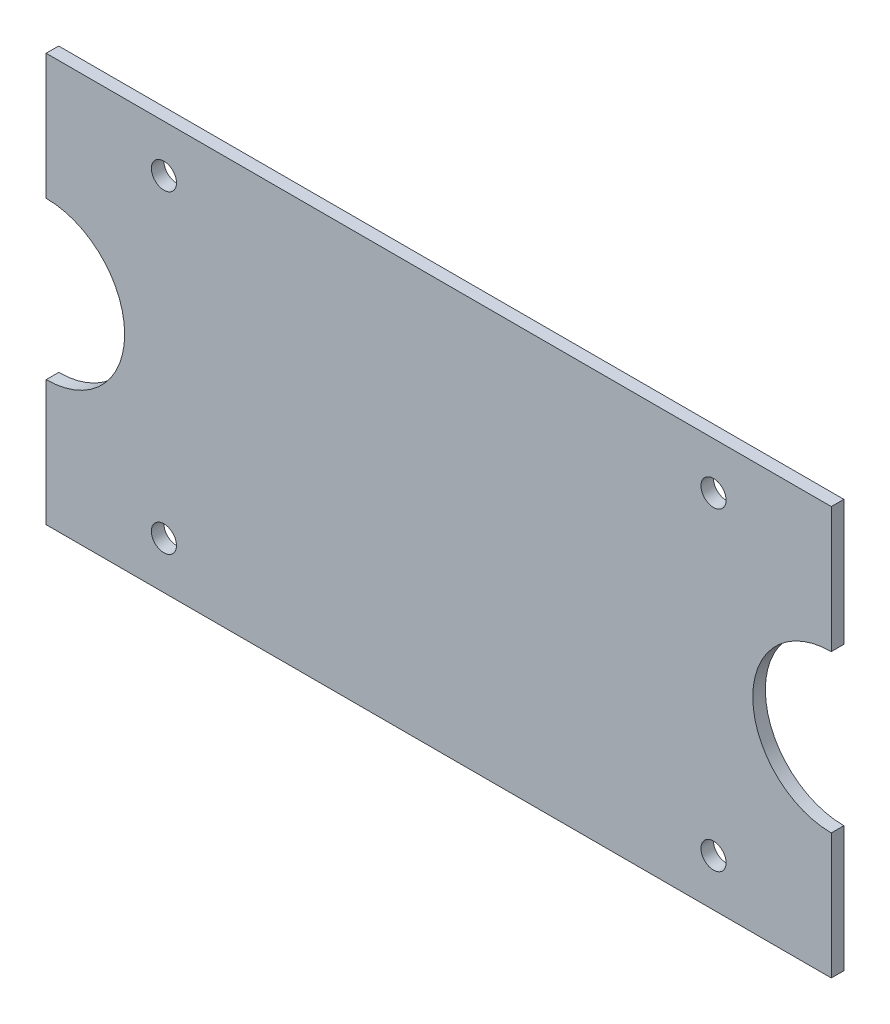
ISO-10303-21;
HEADER;
FILE_DESCRIPTION(('STEP AP214'),'2;1');
FILE_NAME('part.step','',(''),(''),'','','');
FILE_SCHEMA(('AUTOMOTIVE_DESIGN { 1 0 10303 214 1 1 1 1 }'));
ENDSEC;
DATA;
#1=APPLICATION_CONTEXT('core data for automotive mechanical design processes');
#2=APPLICATION_PROTOCOL_DEFINITION('international standard','automotive_design',2000,#1);
#3=PRODUCT_CONTEXT('',#1,'mechanical');
#4=PRODUCT('Part','Part','',(#3));
#5=PRODUCT_RELATED_PRODUCT_CATEGORY('part','',(#4));
#6=PRODUCT_DEFINITION_FORMATION('','',#4);
#7=PRODUCT_DEFINITION_CONTEXT('part definition',#1,'design');
#8=PRODUCT_DEFINITION('design','',#6,#7);
#9=PRODUCT_DEFINITION_SHAPE('','',#8);
#10=(LENGTH_UNIT() NAMED_UNIT(*) SI_UNIT(.MILLI.,.METRE.));
#11=(NAMED_UNIT(*) PLANE_ANGLE_UNIT() SI_UNIT($,.RADIAN.));
#12=(NAMED_UNIT(*) SI_UNIT($,.STERADIAN.) SOLID_ANGLE_UNIT());
#13=UNCERTAINTY_MEASURE_WITH_UNIT(LENGTH_MEASURE(1.E-05),#10,'distance_accuracy_value','');
#14=(GEOMETRIC_REPRESENTATION_CONTEXT(3) GLOBAL_UNCERTAINTY_ASSIGNED_CONTEXT((#13)) GLOBAL_UNIT_ASSIGNED_CONTEXT((#10,
#11,#12)) REPRESENTATION_CONTEXT('',''));
#15=CARTESIAN_POINT('',(0.,0.,0.));
#16=DIRECTION('',(0.,0.,1.));
#17=DIRECTION('',(1.,0.,0.));
#18=AXIS2_PLACEMENT_3D('',#15,#16,#17);
#19=CARTESIAN_POINT('',(0.,0.,1.6));
#20=DIRECTION('',(1.,0.,0.));
#21=DIRECTION('',(0.,0.,-1.));
#22=AXIS2_PLACEMENT_3D('',#19,#20,#21);
#23=PLANE('',#22);
#24=DIRECTION('',(0.,-1.,0.));
#25=VECTOR('',#24,1.);
#26=CARTESIAN_POINT('',(0.,0.,1.6));
#27=LINE('',#26,#25);
#28=CARTESIAN_POINT('',(0.,16.,1.6));
#29=VERTEX_POINT('',#28);
#30=CARTESIAN_POINT('',(0.,0.,1.6));
#31=VERTEX_POINT('',#30);
#32=EDGE_CURVE('E133',#29,#31,#27,.T.);
#33=ORIENTED_EDGE('',*,*,#32,.F.);
#34=DIRECTION('',(0.,0.,-1.));
#35=VECTOR('',#34,1.);
#36=CARTESIAN_POINT('',(0.,16.,1.6));
#37=LINE('',#36,#35);
#38=CARTESIAN_POINT('',(0.,16.,0.));
#39=VERTEX_POINT('',#38);
#40=EDGE_CURVE('E11',#29,#39,#37,.T.);
#41=ORIENTED_EDGE('',*,*,#40,.T.);
#42=DIRECTION('',(0.,-1.,0.));
#43=VECTOR('',#42,1.);
#44=CARTESIAN_POINT('',(0.,0.,0.));
#45=LINE('',#44,#43);
#46=CARTESIAN_POINT('',(0.,0.,0.));
#47=VERTEX_POINT('',#46);
#48=EDGE_CURVE('E168',#39,#47,#45,.T.);
#49=ORIENTED_EDGE('',*,*,#48,.T.);
#50=DIRECTION('',(0.,0.,-1.));
#51=VECTOR('',#50,1.);
#52=CARTESIAN_POINT('',(0.,0.,1.6));
#53=LINE('',#52,#51);
#54=EDGE_CURVE('E143',#31,#47,#53,.T.);
#55=ORIENTED_EDGE('',*,*,#54,.F.);
#56=EDGE_LOOP('',(#33,#41,#49,#55));
#57=FACE_BOUND('',#56,.T.);
#58=ADVANCED_FACE('F39',(#57),#23,.F.);
#59=CARTESIAN_POINT('',(100.,0.,1.6));
#60=DIRECTION('',(-1.,0.,0.));
#61=DIRECTION('',(0.,0.,1.));
#62=AXIS2_PLACEMENT_3D('',#59,#60,#61);
#63=PLANE('',#62);
#64=DIRECTION('',(0.,1.,0.));
#65=VECTOR('',#64,1.);
#66=CARTESIAN_POINT('',(100.,0.,1.6));
#67=LINE('',#66,#65);
#68=CARTESIAN_POINT('',(100.,36.,1.6));
#69=VERTEX_POINT('',#68);
#70=CARTESIAN_POINT('',(100.,52.,1.6));
#71=VERTEX_POINT('',#70);
#72=EDGE_CURVE('E118',#69,#71,#67,.T.);
#73=ORIENTED_EDGE('',*,*,#72,.F.);
#74=DIRECTION('',(0.,0.,-1.));
#75=VECTOR('',#74,1.);
#76=CARTESIAN_POINT('',(100.,36.,1.6));
#77=LINE('',#76,#75);
#78=CARTESIAN_POINT('',(100.,36.,0.));
#79=VERTEX_POINT('',#78);
#80=EDGE_CURVE('E105',#69,#79,#77,.T.);
#81=ORIENTED_EDGE('',*,*,#80,.T.);
#82=DIRECTION('',(0.,1.,0.));
#83=VECTOR('',#82,1.);
#84=CARTESIAN_POINT('',(100.,0.,0.));
#85=LINE('',#84,#83);
#86=CARTESIAN_POINT('',(100.,52.,0.));
#87=VERTEX_POINT('',#86);
#88=EDGE_CURVE('E116',#79,#87,#85,.T.);
#89=ORIENTED_EDGE('',*,*,#88,.T.);
#90=DIRECTION('',(0.,0.,-1.));
#91=VECTOR('',#90,1.);
#92=CARTESIAN_POINT('',(100.,52.,1.6));
#93=LINE('',#92,#91);
#94=EDGE_CURVE('E137',#71,#87,#93,.T.);
#95=ORIENTED_EDGE('',*,*,#94,.F.);
#96=EDGE_LOOP('',(#73,#81,#89,#95));
#97=FACE_BOUND('',#96,.T.);
#98=ADVANCED_FACE('F114',(#97),#63,.F.);
#99=CARTESIAN_POINT('',(0.,0.,1.6));
#100=DIRECTION('',(0.,0.,-1.));
#101=DIRECTION('',(-1.,0.,0.));
#102=AXIS2_PLACEMENT_3D('',#99,#100,#101);
#103=PLANE('',#102);
#104=CARTESIAN_POINT('',(100.,0.,1.6));
#105=VERTEX_POINT('',#104);
#106=CARTESIAN_POINT('',(100.,16.,1.6));
#107=VERTEX_POINT('',#106);
#108=EDGE_CURVE('E166',#105,#107,#67,.T.);
#109=ORIENTED_EDGE('',*,*,#108,.T.);
#110=CARTESIAN_POINT('',(100.,26.,1.6));
#111=DIRECTION('',(0.,0.,-1.));
#112=DIRECTION('',(-1.,0.,0.));
#113=AXIS2_PLACEMENT_3D('',#110,#111,#112);
#114=CIRCLE('',#113,9.99999999999999);
#115=EDGE_CURVE('E62',#107,#69,#114,.T.);
#116=ORIENTED_EDGE('',*,*,#115,.T.);
#117=ORIENTED_EDGE('',*,*,#72,.T.);
#118=DIRECTION('',(-1.,0.,0.));
#119=VECTOR('',#118,1.);
#120=CARTESIAN_POINT('',(0.,52.,1.6));
#121=LINE('',#120,#119);
#122=CARTESIAN_POINT('',(0.,52.,1.6));
#123=VERTEX_POINT('',#122);
#124=EDGE_CURVE('E138',#71,#123,#121,.T.);
#125=ORIENTED_EDGE('',*,*,#124,.T.);
#126=CARTESIAN_POINT('',(0.,36.,1.6));
#127=VERTEX_POINT('',#126);
#128=EDGE_CURVE('E150',#123,#127,#27,.T.);
#129=ORIENTED_EDGE('',*,*,#128,.T.);
#130=CARTESIAN_POINT('',(0.,26.,1.6));
#131=DIRECTION('',(0.,0.,-1.));
#132=DIRECTION('',(-1.,0.,0.));
#133=AXIS2_PLACEMENT_3D('',#130,#131,#132);
#134=CIRCLE('',#133,10.);
#135=EDGE_CURVE('E54',#127,#29,#134,.T.);
#136=ORIENTED_EDGE('',*,*,#135,.T.);
#137=ORIENTED_EDGE('',*,*,#32,.T.);
#138=DIRECTION('',(1.,0.,0.));
#139=VECTOR('',#138,1.);
#140=CARTESIAN_POINT('',(0.,0.,1.6));
#141=LINE('',#140,#139);
#142=EDGE_CURVE('E159',#31,#105,#141,.T.);
#143=ORIENTED_EDGE('',*,*,#142,.T.);
#144=EDGE_LOOP('',(#109,#116,#117,#125,#129,#136,#137,#143));
#145=FACE_BOUND('',#144,.T.);
#146=CARTESIAN_POINT('',(15.,46.,1.6));
#147=DIRECTION('',(0.,0.,1.));
#148=DIRECTION('',(1.,0.,0.));
#149=AXIS2_PLACEMENT_3D('',#146,#147,#148);
#150=CIRCLE('',#149,1.6);
#151=CARTESIAN_POINT('',(16.6,46.,1.6));
#152=VERTEX_POINT('',#151);
#153=EDGE_CURVE('E169',#152,#152,#150,.T.);
#154=ORIENTED_EDGE('',*,*,#153,.F.);
#155=EDGE_LOOP('',(#154));
#156=FACE_BOUND('',#155,.T.);
#157=CARTESIAN_POINT('',(15.,6.,1.6));
#158=DIRECTION('',(0.,0.,1.));
#159=DIRECTION('',(1.,0.,0.));
#160=AXIS2_PLACEMENT_3D('',#157,#158,#159);
#161=CIRCLE('',#160,1.6);
#162=CARTESIAN_POINT('',(16.6,6.,1.6));
#163=VERTEX_POINT('',#162);
#164=EDGE_CURVE('E178',#163,#163,#161,.T.);
#165=ORIENTED_EDGE('',*,*,#164,.F.);
#166=EDGE_LOOP('',(#165));
#167=FACE_BOUND('',#166,.T.);
#168=CARTESIAN_POINT('',(85.,46.,1.6));
#169=DIRECTION('',(0.,0.,1.));
#170=DIRECTION('',(1.,0.,0.));
#171=AXIS2_PLACEMENT_3D('',#168,#169,#170);
#172=CIRCLE('',#171,1.60000000000001);
#173=CARTESIAN_POINT('',(86.6,46.,1.6));
#174=VERTEX_POINT('',#173);
#175=EDGE_CURVE('E183',#174,#174,#172,.T.);
#176=ORIENTED_EDGE('',*,*,#175,.F.);
#177=EDGE_LOOP('',(#176));
#178=FACE_BOUND('',#177,.T.);
#179=CARTESIAN_POINT('',(85.,6.,1.6));
#180=DIRECTION('',(0.,0.,1.));
#181=DIRECTION('',(1.,0.,0.));
#182=AXIS2_PLACEMENT_3D('',#179,#180,#181);
#183=CIRCLE('',#182,1.60000000000001);
#184=CARTESIAN_POINT('',(86.6,6.,1.6));
#185=VERTEX_POINT('',#184);
#186=EDGE_CURVE('E189',#185,#185,#183,.T.);
#187=ORIENTED_EDGE('',*,*,#186,.F.);
#188=EDGE_LOOP('',(#187));
#189=FACE_BOUND('',#188,.T.);
#190=ADVANCED_FACE('F154',(#145,#156,#167,#178,#189),#103,.F.);
#191=CARTESIAN_POINT('',(0.,0.,0.));
#192=DIRECTION('',(0.,0.,-1.));
#193=DIRECTION('',(-1.,0.,0.));
#194=AXIS2_PLACEMENT_3D('',#191,#192,#193);
#195=PLANE('',#194);
#196=CARTESIAN_POINT('',(100.,26.,0.));
#197=DIRECTION('',(0.,0.,-1.));
#198=DIRECTION('',(-1.,0.,0.));
#199=AXIS2_PLACEMENT_3D('',#196,#197,#198);
#200=CIRCLE('',#199,9.99999999999999);
#201=CARTESIAN_POINT('',(100.,16.,0.));
#202=VERTEX_POINT('',#201);
#203=EDGE_CURVE('E102',#202,#79,#200,.T.);
#204=ORIENTED_EDGE('',*,*,#203,.F.);
#205=CARTESIAN_POINT('',(100.,0.,0.));
#206=VERTEX_POINT('',#205);
#207=EDGE_CURVE('E125',#206,#202,#85,.T.);
#208=ORIENTED_EDGE('',*,*,#207,.F.);
#209=DIRECTION('',(1.,0.,0.));
#210=VECTOR('',#209,1.);
#211=CARTESIAN_POINT('',(0.,0.,0.));
#212=LINE('',#211,#210);
#213=EDGE_CURVE('E126',#47,#206,#212,.T.);
#214=ORIENTED_EDGE('',*,*,#213,.F.);
#215=ORIENTED_EDGE('',*,*,#48,.F.);
#216=CARTESIAN_POINT('',(0.,26.,0.));
#217=DIRECTION('',(0.,0.,-1.));
#218=DIRECTION('',(-1.,0.,0.));
#219=AXIS2_PLACEMENT_3D('',#216,#217,#218);
#220=CIRCLE('',#219,10.);
#221=CARTESIAN_POINT('',(0.,36.,0.));
#222=VERTEX_POINT('',#221);
#223=EDGE_CURVE('E197',#222,#39,#220,.T.);
#224=ORIENTED_EDGE('',*,*,#223,.F.);
#225=CARTESIAN_POINT('',(0.,52.,0.));
#226=VERTEX_POINT('',#225);
#227=EDGE_CURVE('E128',#226,#222,#45,.T.);
#228=ORIENTED_EDGE('',*,*,#227,.F.);
#229=DIRECTION('',(-1.,0.,0.));
#230=VECTOR('',#229,1.);
#231=CARTESIAN_POINT('',(0.,52.,0.));
#232=LINE('',#231,#230);
#233=EDGE_CURVE('E124',#87,#226,#232,.T.);
#234=ORIENTED_EDGE('',*,*,#233,.F.);
#235=ORIENTED_EDGE('',*,*,#88,.F.);
#236=EDGE_LOOP('',(#204,#208,#214,#215,#224,#228,#234,#235));
#237=FACE_BOUND('',#236,.T.);
#238=CARTESIAN_POINT('',(85.,46.,0.));
#239=DIRECTION('',(0.,0.,1.));
#240=DIRECTION('',(1.,0.,0.));
#241=AXIS2_PLACEMENT_3D('',#238,#239,#240);
#242=CIRCLE('',#241,1.60000000000001);
#243=CARTESIAN_POINT('',(86.6,46.,0.));
#244=VERTEX_POINT('',#243);
#245=EDGE_CURVE('E186',#244,#244,#242,.T.);
#246=ORIENTED_EDGE('',*,*,#245,.T.);
#247=EDGE_LOOP('',(#246));
#248=FACE_BOUND('',#247,.T.);
#249=CARTESIAN_POINT('',(15.,46.,0.));
#250=DIRECTION('',(0.,0.,1.));
#251=DIRECTION('',(1.,0.,0.));
#252=AXIS2_PLACEMENT_3D('',#249,#250,#251);
#253=CIRCLE('',#252,1.6);
#254=CARTESIAN_POINT('',(16.6,46.,0.));
#255=VERTEX_POINT('',#254);
#256=EDGE_CURVE('E163',#255,#255,#253,.T.);
#257=ORIENTED_EDGE('',*,*,#256,.T.);
#258=EDGE_LOOP('',(#257));
#259=FACE_BOUND('',#258,.T.);
#260=CARTESIAN_POINT('',(15.,6.,0.));
#261=DIRECTION('',(0.,0.,1.));
#262=DIRECTION('',(1.,0.,0.));
#263=AXIS2_PLACEMENT_3D('',#260,#261,#262);
#264=CIRCLE('',#263,1.6);
#265=CARTESIAN_POINT('',(16.6,6.,0.));
#266=VERTEX_POINT('',#265);
#267=EDGE_CURVE('E180',#266,#266,#264,.T.);
#268=ORIENTED_EDGE('',*,*,#267,.T.);
#269=EDGE_LOOP('',(#268));
#270=FACE_BOUND('',#269,.T.);
#271=CARTESIAN_POINT('',(85.,6.,0.));
#272=DIRECTION('',(0.,0.,1.));
#273=DIRECTION('',(1.,0.,0.));
#274=AXIS2_PLACEMENT_3D('',#271,#272,#273);
#275=CIRCLE('',#274,1.60000000000001);
#276=CARTESIAN_POINT('',(86.6,6.,0.));
#277=VERTEX_POINT('',#276);
#278=EDGE_CURVE('E192',#277,#277,#275,.T.);
#279=ORIENTED_EDGE('',*,*,#278,.T.);
#280=EDGE_LOOP('',(#279));
#281=FACE_BOUND('',#280,.T.);
#282=ADVANCED_FACE('F121',(#237,#248,#259,#270,#281),#195,.T.);
#283=ORIENTED_EDGE('',*,*,#227,.T.);
#284=DIRECTION('',(0.,0.,-1.));
#285=VECTOR('',#284,1.);
#286=CARTESIAN_POINT('',(0.,36.,1.6));
#287=LINE('',#286,#285);
#288=EDGE_CURVE('E47',#222,#127,#287,.F.);
#289=ORIENTED_EDGE('',*,*,#288,.T.);
#290=ORIENTED_EDGE('',*,*,#128,.F.);
#291=DIRECTION('',(0.,0.,-1.));
#292=VECTOR('',#291,1.);
#293=CARTESIAN_POINT('',(0.,52.,1.6));
#294=LINE('',#293,#292);
#295=EDGE_CURVE('E134',#123,#226,#294,.T.);
#296=ORIENTED_EDGE('',*,*,#295,.T.);
#297=EDGE_LOOP('',(#283,#289,#290,#296));
#298=FACE_BOUND('',#297,.T.);
#299=ADVANCED_FACE('F41',(#298),#23,.F.);
#300=CARTESIAN_POINT('',(0.,0.,1.6));
#301=DIRECTION('',(0.,1.,0.));
#302=DIRECTION('',(0.,0.,1.));
#303=AXIS2_PLACEMENT_3D('',#300,#301,#302);
#304=PLANE('',#303);
#305=ORIENTED_EDGE('',*,*,#213,.T.);
#306=DIRECTION('',(0.,0.,-1.));
#307=VECTOR('',#306,1.);
#308=CARTESIAN_POINT('',(100.,0.,1.6));
#309=LINE('',#308,#307);
#310=EDGE_CURVE('E140',#105,#206,#309,.T.);
#311=ORIENTED_EDGE('',*,*,#310,.F.);
#312=ORIENTED_EDGE('',*,*,#142,.F.);
#313=ORIENTED_EDGE('',*,*,#54,.T.);
#314=EDGE_LOOP('',(#305,#311,#312,#313));
#315=FACE_BOUND('',#314,.T.);
#316=ADVANCED_FACE('F206',(#315),#304,.F.);
#317=ORIENTED_EDGE('',*,*,#207,.T.);
#318=DIRECTION('',(0.,0.,-1.));
#319=VECTOR('',#318,1.);
#320=CARTESIAN_POINT('',(100.,16.,1.6));
#321=LINE('',#320,#319);
#322=EDGE_CURVE('E106',#202,#107,#321,.F.);
#323=ORIENTED_EDGE('',*,*,#322,.T.);
#324=ORIENTED_EDGE('',*,*,#108,.F.);
#325=ORIENTED_EDGE('',*,*,#310,.T.);
#326=EDGE_LOOP('',(#317,#323,#324,#325));
#327=FACE_BOUND('',#326,.T.);
#328=ADVANCED_FACE('F204',(#327),#63,.F.);
#329=CARTESIAN_POINT('',(0.,52.,1.6));
#330=DIRECTION('',(0.,-1.,0.));
#331=DIRECTION('',(0.,0.,-1.));
#332=AXIS2_PLACEMENT_3D('',#329,#330,#331);
#333=PLANE('',#332);
#334=ORIENTED_EDGE('',*,*,#233,.T.);
#335=ORIENTED_EDGE('',*,*,#295,.F.);
#336=ORIENTED_EDGE('',*,*,#124,.F.);
#337=ORIENTED_EDGE('',*,*,#94,.T.);
#338=EDGE_LOOP('',(#334,#335,#336,#337));
#339=FACE_BOUND('',#338,.T.);
#340=ADVANCED_FACE('F235',(#339),#333,.F.);
#341=CARTESIAN_POINT('',(15.,46.,1.6));
#342=DIRECTION('',(0.,0.,-1.));
#343=DIRECTION('',(-1.,0.,0.));
#344=AXIS2_PLACEMENT_3D('',#341,#342,#343);
#345=CYLINDRICAL_SURFACE('',#344,1.6);
#346=ORIENTED_EDGE('',*,*,#153,.T.);
#347=EDGE_LOOP('',(#346));
#348=FACE_BOUND('',#347,.T.);
#349=ORIENTED_EDGE('',*,*,#256,.F.);
#350=EDGE_LOOP('',(#349));
#351=FACE_BOUND('',#350,.T.);
#352=ADVANCED_FACE('F237',(#348,#351),#345,.F.);
#353=CARTESIAN_POINT('',(15.,6.,1.6));
#354=DIRECTION('',(0.,0.,-1.));
#355=DIRECTION('',(-1.,0.,0.));
#356=AXIS2_PLACEMENT_3D('',#353,#354,#355);
#357=CYLINDRICAL_SURFACE('',#356,1.6);
#358=ORIENTED_EDGE('',*,*,#164,.T.);
#359=EDGE_LOOP('',(#358));
#360=FACE_BOUND('',#359,.T.);
#361=ORIENTED_EDGE('',*,*,#267,.F.);
#362=EDGE_LOOP('',(#361));
#363=FACE_BOUND('',#362,.T.);
#364=ADVANCED_FACE('F272',(#360,#363),#357,.F.);
#365=CARTESIAN_POINT('',(85.,46.,1.6));
#366=DIRECTION('',(0.,0.,-1.));
#367=DIRECTION('',(-1.,0.,0.));
#368=AXIS2_PLACEMENT_3D('',#365,#366,#367);
#369=CYLINDRICAL_SURFACE('',#368,1.60000000000001);
#370=ORIENTED_EDGE('',*,*,#175,.T.);
#371=EDGE_LOOP('',(#370));
#372=FACE_BOUND('',#371,.T.);
#373=ORIENTED_EDGE('',*,*,#245,.F.);
#374=EDGE_LOOP('',(#373));
#375=FACE_BOUND('',#374,.T.);
#376=ADVANCED_FACE('F266',(#372,#375),#369,.F.);
#377=CARTESIAN_POINT('',(85.,6.,1.6));
#378=DIRECTION('',(0.,0.,-1.));
#379=DIRECTION('',(-1.,0.,0.));
#380=AXIS2_PLACEMENT_3D('',#377,#378,#379);
#381=CYLINDRICAL_SURFACE('',#380,1.60000000000001);
#382=ORIENTED_EDGE('',*,*,#186,.T.);
#383=EDGE_LOOP('',(#382));
#384=FACE_BOUND('',#383,.T.);
#385=ORIENTED_EDGE('',*,*,#278,.F.);
#386=EDGE_LOOP('',(#385));
#387=FACE_BOUND('',#386,.T.);
#388=ADVANCED_FACE('F213',(#384,#387),#381,.F.);
#389=CARTESIAN_POINT('',(100.,26.,1.6));
#390=DIRECTION('',(0.,0.,-1.));
#391=DIRECTION('',(-1.,0.,0.));
#392=AXIS2_PLACEMENT_3D('',#389,#390,#391);
#393=CYLINDRICAL_SURFACE('',#392,9.99999999999999);
#394=ORIENTED_EDGE('',*,*,#115,.F.);
#395=ORIENTED_EDGE('',*,*,#322,.F.);
#396=ORIENTED_EDGE('',*,*,#203,.T.);
#397=ORIENTED_EDGE('',*,*,#80,.F.);
#398=EDGE_LOOP('',(#394,#395,#396,#397));
#399=FACE_BOUND('',#398,.T.);
#400=ADVANCED_FACE('F104',(#399),#393,.F.);
#401=CARTESIAN_POINT('',(0.,26.,1.6));
#402=DIRECTION('',(0.,0.,-1.));
#403=DIRECTION('',(-1.,0.,0.));
#404=AXIS2_PLACEMENT_3D('',#401,#402,#403);
#405=CYLINDRICAL_SURFACE('',#404,10.);
#406=ORIENTED_EDGE('',*,*,#135,.F.);
#407=ORIENTED_EDGE('',*,*,#288,.F.);
#408=ORIENTED_EDGE('',*,*,#223,.T.);
#409=ORIENTED_EDGE('',*,*,#40,.F.);
#410=EDGE_LOOP('',(#406,#407,#408,#409));
#411=FACE_BOUND('',#410,.T.);
#412=ADVANCED_FACE('F207',(#411),#405,.F.);
#413=CLOSED_SHELL('',(#58,#98,#190,#282,#299,#316,#328,#340,#352,#364,#376,#388,#400,#412));
#414=MANIFOLD_SOLID_BREP('B2',#413);
#415=ADVANCED_BREP_SHAPE_REPRESENTATION('',(#18,#414),#14);
#416=SHAPE_DEFINITION_REPRESENTATION(#9,#415);
ENDSEC;
END-ISO-10303-21;
